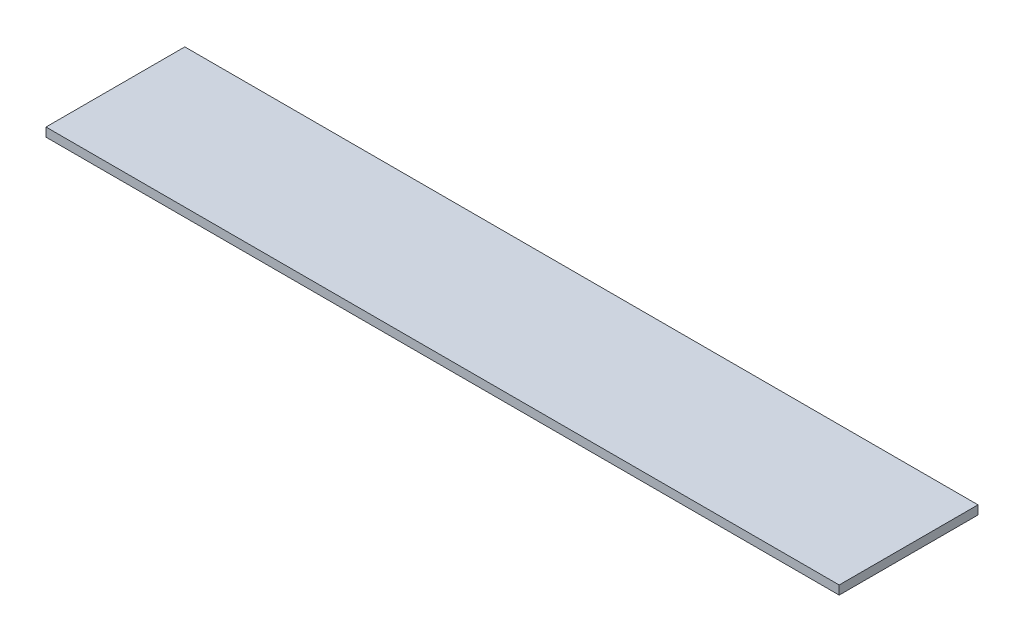
ISO-10303-21;
HEADER;
FILE_DESCRIPTION(('STEP AP214'),'2;1');
FILE_NAME('part.step','',(''),(''),'','','');
FILE_SCHEMA(('AUTOMOTIVE_DESIGN { 1 0 10303 214 1 1 1 1 }'));
ENDSEC;
DATA;
#1=APPLICATION_CONTEXT('core data for automotive mechanical design processes');
#2=APPLICATION_PROTOCOL_DEFINITION('international standard','automotive_design',2000,#1);
#3=PRODUCT_CONTEXT('',#1,'mechanical');
#4=PRODUCT('Part','Part','',(#3));
#5=PRODUCT_RELATED_PRODUCT_CATEGORY('part','',(#4));
#6=PRODUCT_DEFINITION_FORMATION('','',#4);
#7=PRODUCT_DEFINITION_CONTEXT('part definition',#1,'design');
#8=PRODUCT_DEFINITION('design','',#6,#7);
#9=PRODUCT_DEFINITION_SHAPE('','',#8);
#10=(LENGTH_UNIT() NAMED_UNIT(*) SI_UNIT(.MILLI.,.METRE.));
#11=(NAMED_UNIT(*) PLANE_ANGLE_UNIT() SI_UNIT($,.RADIAN.));
#12=(NAMED_UNIT(*) SI_UNIT($,.STERADIAN.) SOLID_ANGLE_UNIT());
#13=UNCERTAINTY_MEASURE_WITH_UNIT(LENGTH_MEASURE(1.E-05),#10,'distance_accuracy_value','');
#14=(GEOMETRIC_REPRESENTATION_CONTEXT(3) GLOBAL_UNCERTAINTY_ASSIGNED_CONTEXT((#13)) GLOBAL_UNIT_ASSIGNED_CONTEXT((#10,
#11,#12)) REPRESENTATION_CONTEXT('',''));
#15=CARTESIAN_POINT('',(0.,0.,0.));
#16=DIRECTION('',(0.,0.,1.));
#17=DIRECTION('',(1.,0.,0.));
#18=AXIS2_PLACEMENT_3D('',#15,#16,#17);
#19=CARTESIAN_POINT('',(119.916334661354,25.4,-173.423306772908));
#20=DIRECTION('',(-1.,0.,0.));
#21=DIRECTION('',(0.,0.,1.));
#22=AXIS2_PLACEMENT_3D('',#19,#20,#21);
#23=PLANE('',#22);
#24=DIRECTION('',(0.,1.,0.));
#25=VECTOR('',#24,1.);
#26=CARTESIAN_POINT('',(119.916334661355,116.478975515723,207.576693227092));
#27=LINE('',#26,#25);
#28=CARTESIAN_POINT('',(119.916334661355,154.94,207.576693227092));
#29=VERTEX_POINT('',#28);
#30=CARTESIAN_POINT('',(119.916334661355,160.02,207.576693227092));
#31=VERTEX_POINT('',#30);
#32=EDGE_CURVE('E11',#29,#31,#27,.T.);
#33=ORIENTED_EDGE('',*,*,#32,.F.);
#34=DIRECTION('',(0.,0.,-1.));
#35=VECTOR('',#34,1.);
#36=CARTESIAN_POINT('',(119.916334661355,154.94,-1.69309011255337E-13));
#37=LINE('',#36,#35);
#38=CARTESIAN_POINT('',(119.916334661355,154.94,127.566693227092));
#39=VERTEX_POINT('',#38);
#40=EDGE_CURVE('E63',#29,#39,#37,.T.);
#41=ORIENTED_EDGE('',*,*,#40,.T.);
#42=DIRECTION('',(0.,-1.,0.));
#43=VECTOR('',#42,1.);
#44=CARTESIAN_POINT('',(119.916334661355,160.02,127.566693227092));
#45=LINE('',#44,#43);
#46=CARTESIAN_POINT('',(119.916334661355,160.02,127.566693227092));
#47=VERTEX_POINT('',#46);
#48=EDGE_CURVE('E92',#47,#39,#45,.T.);
#49=ORIENTED_EDGE('',*,*,#48,.F.);
#50=DIRECTION('',(0.,0.,-1.));
#51=VECTOR('',#50,1.);
#52=CARTESIAN_POINT('',(119.916334661355,160.02,207.576693227092));
#53=LINE('',#52,#51);
#54=EDGE_CURVE('E81',#31,#47,#53,.T.);
#55=ORIENTED_EDGE('',*,*,#54,.F.);
#56=EDGE_LOOP('',(#33,#41,#49,#55));
#57=FACE_BOUND('',#56,.T.);
#58=ADVANCED_FACE('F41',(#57),#23,.F.);
#59=CARTESIAN_POINT('',(-261.083665338646,25.4,207.576693227092));
#60=DIRECTION('',(0.,0.,-1.));
#61=DIRECTION('',(-1.,0.,0.));
#62=AXIS2_PLACEMENT_3D('',#59,#60,#61);
#63=PLANE('',#62);
#64=DIRECTION('',(1.,0.,0.));
#65=VECTOR('',#64,1.);
#66=CARTESIAN_POINT('',(119.916334661355,160.02,207.576693227092));
#67=LINE('',#66,#65);
#68=CARTESIAN_POINT('',(-337.283665338646,160.02,207.576693227092));
#69=VERTEX_POINT('',#68);
#70=EDGE_CURVE('E50',#69,#31,#67,.T.);
#71=ORIENTED_EDGE('',*,*,#70,.F.);
#72=DIRECTION('',(0.,1.,0.));
#73=VECTOR('',#72,1.);
#74=CARTESIAN_POINT('',(-337.283665338646,74.6181474317232,207.576693227092));
#75=LINE('',#74,#73);
#76=CARTESIAN_POINT('',(-337.283665338646,154.94,207.576693227092));
#77=VERTEX_POINT('',#76);
#78=EDGE_CURVE('E113',#77,#69,#75,.T.);
#79=ORIENTED_EDGE('',*,*,#78,.F.);
#80=DIRECTION('',(-1.,0.,0.));
#81=VECTOR('',#80,1.);
#82=CARTESIAN_POINT('',(119.916334661355,154.94,207.576693227092));
#83=LINE('',#82,#81);
#84=EDGE_CURVE('E89',#29,#77,#83,.T.);
#85=ORIENTED_EDGE('',*,*,#84,.F.);
#86=ORIENTED_EDGE('',*,*,#32,.T.);
#87=EDGE_LOOP('',(#71,#79,#85,#86));
#88=FACE_BOUND('',#87,.T.);
#89=ADVANCED_FACE('F43',(#88),#63,.F.);
#90=CARTESIAN_POINT('',(0.,160.02,0.));
#91=DIRECTION('',(0.,1.,0.));
#92=DIRECTION('',(0.,0.,1.));
#93=AXIS2_PLACEMENT_3D('',#90,#91,#92);
#94=PLANE('',#93);
#95=ORIENTED_EDGE('',*,*,#54,.T.);
#96=DIRECTION('',(1.,0.,0.));
#97=VECTOR('',#96,1.);
#98=CARTESIAN_POINT('',(-337.283665338646,160.02,127.566693227092));
#99=LINE('',#98,#97);
#100=CARTESIAN_POINT('',(-337.283665338646,160.02,127.566693227092));
#101=VERTEX_POINT('',#100);
#102=EDGE_CURVE('E86',#101,#47,#99,.T.);
#103=ORIENTED_EDGE('',*,*,#102,.F.);
#104=DIRECTION('',(0.,0.,1.));
#105=VECTOR('',#104,1.);
#106=CARTESIAN_POINT('',(-337.283665338646,160.02,182.176693227092));
#107=LINE('',#106,#105);
#108=EDGE_CURVE('E109',#101,#69,#107,.T.);
#109=ORIENTED_EDGE('',*,*,#108,.T.);
#110=ORIENTED_EDGE('',*,*,#70,.T.);
#111=EDGE_LOOP('',(#95,#103,#109,#110));
#112=FACE_BOUND('',#111,.T.);
#113=ADVANCED_FACE('F83',(#112),#94,.T.);
#114=CARTESIAN_POINT('',(119.916334661355,154.94,-1.69309011255337E-13));
#115=DIRECTION('',(0.,1.,0.));
#116=DIRECTION('',(0.,0.,1.));
#117=AXIS2_PLACEMENT_3D('',#114,#115,#116);
#118=PLANE('',#117);
#119=ORIENTED_EDGE('',*,*,#84,.T.);
#120=DIRECTION('',(0.,0.,-1.));
#121=VECTOR('',#120,1.);
#122=CARTESIAN_POINT('',(-337.283665338646,154.94,182.176693227092));
#123=LINE('',#122,#121);
#124=CARTESIAN_POINT('',(-337.283665338646,154.94,127.566693227092));
#125=VERTEX_POINT('',#124);
#126=EDGE_CURVE('E110',#77,#125,#123,.T.);
#127=ORIENTED_EDGE('',*,*,#126,.T.);
#128=DIRECTION('',(-1.,0.,0.));
#129=VECTOR('',#128,1.);
#130=CARTESIAN_POINT('',(119.916334661355,154.94,127.566693227092));
#131=LINE('',#130,#129);
#132=EDGE_CURVE('E96',#39,#125,#131,.T.);
#133=ORIENTED_EDGE('',*,*,#132,.F.);
#134=ORIENTED_EDGE('',*,*,#40,.F.);
#135=EDGE_LOOP('',(#119,#127,#133,#134));
#136=FACE_BOUND('',#135,.T.);
#137=ADVANCED_FACE('F124',(#136),#118,.F.);
#138=CARTESIAN_POINT('',(-337.283665338646,74.6181474317232,182.176693227092));
#139=DIRECTION('',(-1.,0.,0.));
#140=DIRECTION('',(0.,0.,1.));
#141=AXIS2_PLACEMENT_3D('',#138,#139,#140);
#142=PLANE('',#141);
#143=ORIENTED_EDGE('',*,*,#126,.F.);
#144=ORIENTED_EDGE('',*,*,#78,.T.);
#145=ORIENTED_EDGE('',*,*,#108,.F.);
#146=DIRECTION('',(0.,1.,0.));
#147=VECTOR('',#146,1.);
#148=CARTESIAN_POINT('',(-337.283665338646,154.94,127.566693227092));
#149=LINE('',#148,#147);
#150=EDGE_CURVE('E101',#125,#101,#149,.T.);
#151=ORIENTED_EDGE('',*,*,#150,.F.);
#152=EDGE_LOOP('',(#143,#144,#145,#151));
#153=FACE_BOUND('',#152,.T.);
#154=ADVANCED_FACE('F127',(#153),#142,.T.);
#155=CARTESIAN_POINT('',(0.,0.,127.566693227092));
#156=DIRECTION('',(0.,0.,-1.));
#157=DIRECTION('',(-1.,0.,0.));
#158=AXIS2_PLACEMENT_3D('',#155,#156,#157);
#159=PLANE('',#158);
#160=ORIENTED_EDGE('',*,*,#102,.T.);
#161=ORIENTED_EDGE('',*,*,#48,.T.);
#162=ORIENTED_EDGE('',*,*,#132,.T.);
#163=ORIENTED_EDGE('',*,*,#150,.T.);
#164=EDGE_LOOP('',(#160,#161,#162,#163));
#165=FACE_BOUND('',#164,.T.);
#166=ADVANCED_FACE('F99',(#165),#159,.T.);
#167=CLOSED_SHELL('',(#58,#89,#113,#137,#154,#166));
#168=MANIFOLD_SOLID_BREP('B2',#167);
#169=ADVANCED_BREP_SHAPE_REPRESENTATION('',(#18,#168),#14);
#170=SHAPE_DEFINITION_REPRESENTATION(#9,#169);
ENDSEC;
END-ISO-10303-21;
